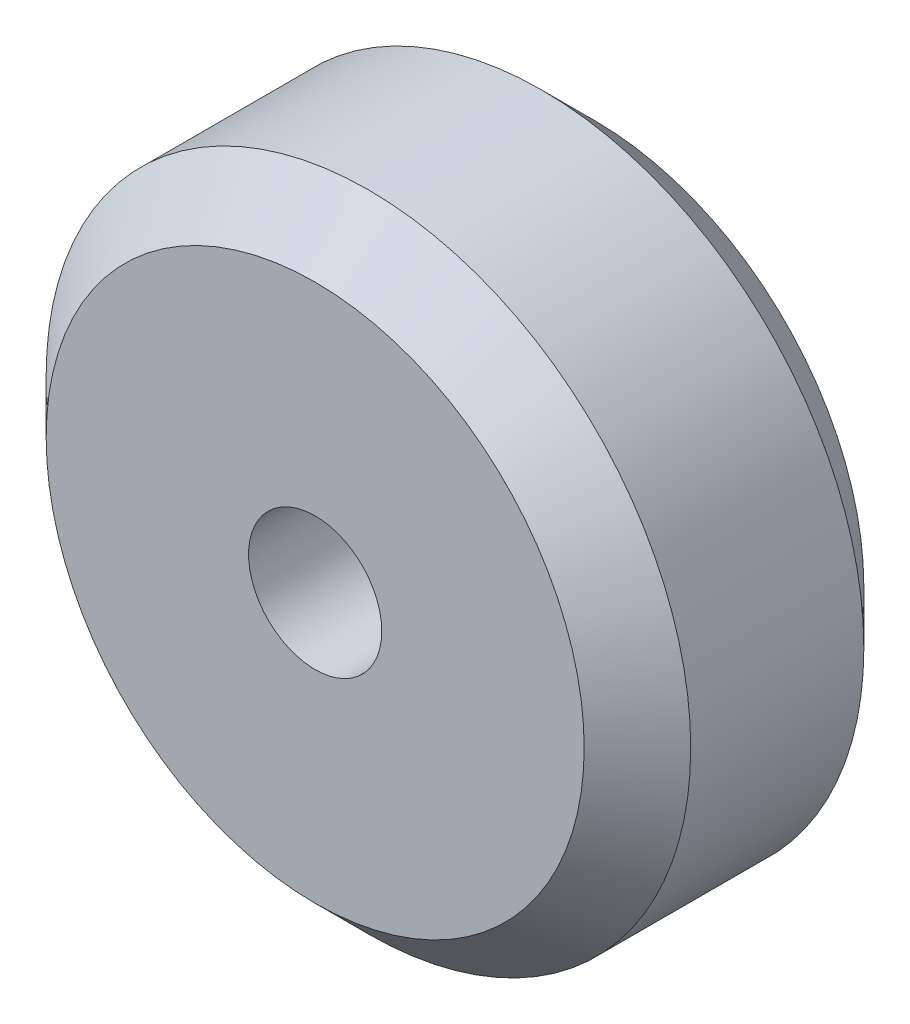
ISO-10303-21;
HEADER;
FILE_DESCRIPTION(('STEP AP214'),'2;1');
FILE_NAME('part.step','',(''),(''),'','','');
FILE_SCHEMA(('AUTOMOTIVE_DESIGN { 1 0 10303 214 1 1 1 1 }'));
ENDSEC;
DATA;
#1=APPLICATION_CONTEXT('core data for automotive mechanical design processes');
#2=APPLICATION_PROTOCOL_DEFINITION('international standard','automotive_design',2000,#1);
#3=PRODUCT_CONTEXT('',#1,'mechanical');
#4=PRODUCT('Part','Part','',(#3));
#5=PRODUCT_RELATED_PRODUCT_CATEGORY('part','',(#4));
#6=PRODUCT_DEFINITION_FORMATION('','',#4);
#7=PRODUCT_DEFINITION_CONTEXT('part definition',#1,'design');
#8=PRODUCT_DEFINITION('design','',#6,#7);
#9=PRODUCT_DEFINITION_SHAPE('','',#8);
#10=(LENGTH_UNIT() NAMED_UNIT(*) SI_UNIT(.MILLI.,.METRE.));
#11=(NAMED_UNIT(*) PLANE_ANGLE_UNIT() SI_UNIT($,.RADIAN.));
#12=(NAMED_UNIT(*) SI_UNIT($,.STERADIAN.) SOLID_ANGLE_UNIT());
#13=UNCERTAINTY_MEASURE_WITH_UNIT(LENGTH_MEASURE(1.E-05),#10,'distance_accuracy_value','');
#14=(GEOMETRIC_REPRESENTATION_CONTEXT(3) GLOBAL_UNCERTAINTY_ASSIGNED_CONTEXT((#13)) GLOBAL_UNIT_ASSIGNED_CONTEXT((#10,
#11,#12)) REPRESENTATION_CONTEXT('',''));
#15=CARTESIAN_POINT('',(0.,0.,0.));
#16=DIRECTION('',(0.,0.,1.));
#17=DIRECTION('',(1.,0.,0.));
#18=AXIS2_PLACEMENT_3D('',#15,#16,#17);
#19=CARTESIAN_POINT('',(0.,0.,10.5));
#20=DIRECTION('',(0.,0.,-1.));
#21=DIRECTION('',(-1.,0.,0.));
#22=AXIS2_PLACEMENT_3D('',#19,#20,#21);
#23=CYLINDRICAL_SURFACE('',#22,12.1);
#24=CARTESIAN_POINT('',(0.,0.,2.00000000000001));
#25=DIRECTION('',(0.,0.,1.));
#26=DIRECTION('',(1.,0.,0.));
#27=AXIS2_PLACEMENT_3D('',#24,#25,#26);
#28=CIRCLE('',#27,12.1);
#29=CARTESIAN_POINT('',(-12.1,0.,2.00000000000001));
#30=VERTEX_POINT('',#29);
#31=EDGE_CURVE('E45',#30,#30,#28,.T.);
#32=CARTESIAN_POINT('',(0.,0.,8.50000000000002));
#33=DIRECTION('',(0.,0.,1.));
#34=DIRECTION('',(1.,0.,0.));
#35=AXIS2_PLACEMENT_3D('',#32,#33,#34);
#36=CIRCLE('',#35,12.1);
#37=CARTESIAN_POINT('',(-12.1,0.,8.50000000000002));
#38=VERTEX_POINT('',#37);
#39=EDGE_CURVE('E49',#38,#38,#36,.F.);
#40=CARTESIAN_POINT('',(-12.1,0.,2.00000000000001));
#41=CARTESIAN_POINT('',(-12.1,0.,2.06770833333334));
#42=CARTESIAN_POINT('',(-12.1,0.,2.13541666666668));
#43=CARTESIAN_POINT('',(-12.1,0.,2.27083333333334));
#44=CARTESIAN_POINT('',(-12.1,0.,2.33854166666668));
#45=CARTESIAN_POINT('',(-12.1,0.,2.47395833333334));
#46=CARTESIAN_POINT('',(-12.1,0.,2.54166666666668));
#47=CARTESIAN_POINT('',(-12.1,0.,2.67708333333334));
#48=CARTESIAN_POINT('',(-12.1,0.,2.74479166666668));
#49=CARTESIAN_POINT('',(-12.1,0.,2.88020833333334));
#50=CARTESIAN_POINT('',(-12.1,0.,2.94791666666668));
#51=CARTESIAN_POINT('',(-12.1,0.,3.08333333333334));
#52=CARTESIAN_POINT('',(-12.1,0.,3.15104166666668));
#53=CARTESIAN_POINT('',(-12.1,0.,3.28645833333334));
#54=CARTESIAN_POINT('',(-12.1,0.,3.35416666666668));
#55=CARTESIAN_POINT('',(-12.1,0.,3.48958333333334));
#56=CARTESIAN_POINT('',(-12.1,0.,3.55729166666668));
#57=CARTESIAN_POINT('',(-12.1,0.,3.69270833333334));
#58=CARTESIAN_POINT('',(-12.1,0.,3.76041666666668));
#59=CARTESIAN_POINT('',(-12.1,0.,3.89583333333334));
#60=CARTESIAN_POINT('',(-12.1,0.,3.96354166666668));
#61=CARTESIAN_POINT('',(-12.1,0.,4.09895833333334));
#62=CARTESIAN_POINT('',(-12.1,0.,4.16666666666668));
#63=CARTESIAN_POINT('',(-12.1,0.,4.30208333333335));
#64=CARTESIAN_POINT('',(-12.1,0.,4.36979166666668));
#65=CARTESIAN_POINT('',(-12.1,0.,4.50520833333335));
#66=CARTESIAN_POINT('',(-12.1,0.,4.57291666666668));
#67=CARTESIAN_POINT('',(-12.1,0.,4.70833333333335));
#68=CARTESIAN_POINT('',(-12.1,0.,4.77604166666668));
#69=CARTESIAN_POINT('',(-12.1,0.,4.91145833333335));
#70=CARTESIAN_POINT('',(-12.1,0.,4.97916666666668));
#71=CARTESIAN_POINT('',(-12.1,0.,5.11458333333335));
#72=CARTESIAN_POINT('',(-12.1,0.,5.18229166666668));
#73=CARTESIAN_POINT('',(-12.1,0.,5.31770833333335));
#74=CARTESIAN_POINT('',(-12.1,0.,5.38541666666668));
#75=CARTESIAN_POINT('',(-12.1,0.,5.52083333333335));
#76=CARTESIAN_POINT('',(-12.1,0.,5.58854166666668));
#77=CARTESIAN_POINT('',(-12.1,0.,5.72395833333335));
#78=CARTESIAN_POINT('',(-12.1,0.,5.79166666666668));
#79=CARTESIAN_POINT('',(-12.1,0.,5.92708333333335));
#80=CARTESIAN_POINT('',(-12.1,0.,5.99479166666668));
#81=CARTESIAN_POINT('',(-12.1,0.,6.13020833333335));
#82=CARTESIAN_POINT('',(-12.1,0.,6.19791666666668));
#83=CARTESIAN_POINT('',(-12.1,0.,6.33333333333335));
#84=CARTESIAN_POINT('',(-12.1,0.,6.40104166666668));
#85=CARTESIAN_POINT('',(-12.1,0.,6.53645833333335));
#86=CARTESIAN_POINT('',(-12.1,0.,6.60416666666668));
#87=CARTESIAN_POINT('',(-12.1,0.,6.73958333333335));
#88=CARTESIAN_POINT('',(-12.1,0.,6.80729166666668));
#89=CARTESIAN_POINT('',(-12.1,0.,6.94270833333335));
#90=CARTESIAN_POINT('',(-12.1,0.,7.01041666666668));
#91=CARTESIAN_POINT('',(-12.1,0.,7.14583333333335));
#92=CARTESIAN_POINT('',(-12.1,0.,7.21354166666668));
#93=CARTESIAN_POINT('',(-12.1,0.,7.34895833333335));
#94=CARTESIAN_POINT('',(-12.1,0.,7.41666666666668));
#95=CARTESIAN_POINT('',(-12.1,0.,7.55208333333335));
#96=CARTESIAN_POINT('',(-12.1,0.,7.61979166666668));
#97=CARTESIAN_POINT('',(-12.1,0.,7.75520833333335));
#98=CARTESIAN_POINT('',(-12.1,0.,7.82291666666668));
#99=CARTESIAN_POINT('',(-12.1,0.,7.95833333333335));
#100=CARTESIAN_POINT('',(-12.1,0.,8.02604166666668));
#101=CARTESIAN_POINT('',(-12.1,0.,8.16145833333335));
#102=CARTESIAN_POINT('',(-12.1,0.,8.22916666666668));
#103=CARTESIAN_POINT('',(-12.1,0.,8.36458333333335));
#104=CARTESIAN_POINT('',(-12.1,0.,8.43229166666668));
#105=CARTESIAN_POINT('',(-12.1,0.,8.50000000000002));
#106=B_SPLINE_CURVE_WITH_KNOTS('',3,(#40,#41,#42,#43,#44,#45,#46,#47,#48,#49,#50,#51,#52,#53,
#54,#55,#56,#57,#58,#59,#60,#61,#62,#63,#64,#65,#66,#67,#68,#69,#70,#71,#72,#73,#74,#75,#76,#77,
#78,#79,#80,#81,#82,#83,#84,#85,#86,#87,#88,#89,#90,#91,#92,#93,#94,#95,#96,#97,#98,#99,#100,
#101,#102,#103,#104,#105),.UNSPECIFIED.,.F.,.F.,(4,2,2,2,2,2,2,2,2,2,2,2,2,2,2,2,2,2,2,2,2,2,2,
2,2,2,2,2,2,2,2,2,4),(0.,0.203125,0.40625,0.609375000000001,0.8125,1.015625,1.21875,1.421875,
1.625,1.828125,2.03125,2.234375,2.4375,2.640625,2.84375,3.046875,3.25,3.453125,3.65625,3.859375,
4.0625,4.26562500000001,4.46875000000001,4.67187500000001,4.87500000000001,5.07812500000001,
5.28125000000001,5.48437500000001,5.68750000000001,5.89062500000001,6.09375000000001,
6.29687500000001,6.50000000000001),.UNSPECIFIED.);
#107=EDGE_CURVE('BSEAM33',#30,#38,#106,.T.);
#108=ORIENTED_EDGE('',*,*,#31,.T.);
#109=ORIENTED_EDGE('',*,*,#39,.T.);
#110=ORIENTED_EDGE('',*,*,#107,.T.);
#111=ORIENTED_EDGE('',*,*,#107,.F.);
#112=EDGE_LOOP('',(#108,#110,#109,#111));
#113=FACE_BOUND('',#112,.T.);
#114=ADVANCED_FACE('F33',(#113),#23,.T.);
#115=CARTESIAN_POINT('',(0.,0.,10.5));
#116=DIRECTION('',(0.,0.,1.));
#117=DIRECTION('',(1.,0.,0.));
#118=AXIS2_PLACEMENT_3D('',#115,#116,#117);
#119=PLANE('',#118);
#120=CARTESIAN_POINT('',(0.,0.,10.5));
#121=DIRECTION('',(0.,0.,1.));
#122=DIRECTION('',(1.,0.,0.));
#123=AXIS2_PLACEMENT_3D('',#120,#121,#122);
#124=CIRCLE('',#123,10.1);
#125=CARTESIAN_POINT('',(10.1,0.,10.5));
#126=VERTEX_POINT('',#125);
#127=EDGE_CURVE('E10',#126,#126,#124,.T.);
#128=ORIENTED_EDGE('',*,*,#127,.T.);
#129=EDGE_LOOP('',(#128));
#130=FACE_BOUND('',#129,.T.);
#131=CARTESIAN_POINT('',(0.,0.,10.5));
#132=DIRECTION('',(0.,0.,1.));
#133=DIRECTION('',(1.,0.,0.));
#134=AXIS2_PLACEMENT_3D('',#131,#132,#133);
#135=CIRCLE('',#134,2.5);
#136=CARTESIAN_POINT('',(2.5,0.,10.5));
#137=VERTEX_POINT('',#136);
#138=EDGE_CURVE('E55',#137,#137,#135,.T.);
#139=ORIENTED_EDGE('',*,*,#138,.F.);
#140=EDGE_LOOP('',(#139));
#141=FACE_BOUND('',#140,.T.);
#142=ADVANCED_FACE('F70',(#130,#141),#119,.T.);
#143=CARTESIAN_POINT('',(0.,0.,0.));
#144=DIRECTION('',(0.,0.,1.));
#145=DIRECTION('',(1.,0.,0.));
#146=AXIS2_PLACEMENT_3D('',#143,#144,#145);
#147=PLANE('',#146);
#148=CARTESIAN_POINT('',(0.,0.,0.));
#149=DIRECTION('',(0.,0.,1.));
#150=DIRECTION('',(1.,0.,0.));
#151=AXIS2_PLACEMENT_3D('',#148,#149,#150);
#152=CIRCLE('',#151,10.1);
#153=CARTESIAN_POINT('',(10.1,0.,0.));
#154=VERTEX_POINT('',#153);
#155=EDGE_CURVE('E41',#154,#154,#152,.F.);
#156=ORIENTED_EDGE('',*,*,#155,.T.);
#157=EDGE_LOOP('',(#156));
#158=FACE_BOUND('',#157,.T.);
#159=CARTESIAN_POINT('',(0.,0.,0.));
#160=DIRECTION('',(0.,0.,1.));
#161=DIRECTION('',(1.,0.,0.));
#162=AXIS2_PLACEMENT_3D('',#159,#160,#161);
#163=CIRCLE('',#162,2.5);
#164=CARTESIAN_POINT('',(2.5,0.,0.));
#165=VERTEX_POINT('',#164);
#166=EDGE_CURVE('E54',#165,#165,#163,.T.);
#167=ORIENTED_EDGE('',*,*,#166,.T.);
#168=EDGE_LOOP('',(#167));
#169=FACE_BOUND('',#168,.T.);
#170=ADVANCED_FACE('F61',(#158,#169),#147,.F.);
#171=CARTESIAN_POINT('',(0.,0.,0.));
#172=DIRECTION('',(0.,0.,1.));
#173=DIRECTION('',(1.,0.,0.));
#174=AXIS2_PLACEMENT_3D('',#171,#172,#173);
#175=CYLINDRICAL_SURFACE('',#174,2.5);
#176=CARTESIAN_POINT('',(2.5,0.,0.));
#177=CARTESIAN_POINT('',(2.5,0.,0.109375));
#178=CARTESIAN_POINT('',(2.5,0.,0.21875));
#179=CARTESIAN_POINT('',(2.5,0.,0.4375));
#180=CARTESIAN_POINT('',(2.5,0.,0.546875));
#181=CARTESIAN_POINT('',(2.5,0.,0.765625));
#182=CARTESIAN_POINT('',(2.5,0.,0.875));
#183=CARTESIAN_POINT('',(2.5,0.,1.09375));
#184=CARTESIAN_POINT('',(2.5,0.,1.203125));
#185=CARTESIAN_POINT('',(2.5,0.,1.421875));
#186=CARTESIAN_POINT('',(2.5,0.,1.53125));
#187=CARTESIAN_POINT('',(2.5,0.,1.75));
#188=CARTESIAN_POINT('',(2.5,0.,1.859375));
#189=CARTESIAN_POINT('',(2.5,0.,2.078125));
#190=CARTESIAN_POINT('',(2.5,0.,2.1875));
#191=CARTESIAN_POINT('',(2.5,0.,2.40625));
#192=CARTESIAN_POINT('',(2.5,0.,2.515625));
#193=CARTESIAN_POINT('',(2.5,0.,2.734375));
#194=CARTESIAN_POINT('',(2.5,0.,2.84375));
#195=CARTESIAN_POINT('',(2.5,0.,3.0625));
#196=CARTESIAN_POINT('',(2.5,0.,3.171875));
#197=CARTESIAN_POINT('',(2.5,0.,3.390625));
#198=CARTESIAN_POINT('',(2.5,0.,3.5));
#199=CARTESIAN_POINT('',(2.5,0.,3.71875));
#200=CARTESIAN_POINT('',(2.5,0.,3.828125));
#201=CARTESIAN_POINT('',(2.5,0.,4.046875));
#202=CARTESIAN_POINT('',(2.5,0.,4.15625));
#203=CARTESIAN_POINT('',(2.5,0.,4.375));
#204=CARTESIAN_POINT('',(2.5,0.,4.484375));
#205=CARTESIAN_POINT('',(2.5,0.,4.703125));
#206=CARTESIAN_POINT('',(2.5,0.,4.8125));
#207=CARTESIAN_POINT('',(2.5,0.,5.03125));
#208=CARTESIAN_POINT('',(2.5,0.,5.140625));
#209=CARTESIAN_POINT('',(2.5,0.,5.359375));
#210=CARTESIAN_POINT('',(2.5,0.,5.46875));
#211=CARTESIAN_POINT('',(2.5,0.,5.6875));
#212=CARTESIAN_POINT('',(2.5,0.,5.796875));
#213=CARTESIAN_POINT('',(2.5,0.,6.015625));
#214=CARTESIAN_POINT('',(2.5,0.,6.125));
#215=CARTESIAN_POINT('',(2.5,0.,6.34375));
#216=CARTESIAN_POINT('',(2.5,0.,6.453125));
#217=CARTESIAN_POINT('',(2.5,0.,6.671875));
#218=CARTESIAN_POINT('',(2.5,0.,6.78125));
#219=CARTESIAN_POINT('',(2.5,0.,7.));
#220=CARTESIAN_POINT('',(2.5,0.,7.109375));
#221=CARTESIAN_POINT('',(2.5,0.,7.328125));
#222=CARTESIAN_POINT('',(2.5,0.,7.4375));
#223=CARTESIAN_POINT('',(2.5,0.,7.65625));
#224=CARTESIAN_POINT('',(2.5,0.,7.765625));
#225=CARTESIAN_POINT('',(2.5,0.,7.984375));
#226=CARTESIAN_POINT('',(2.5,0.,8.09375));
#227=CARTESIAN_POINT('',(2.5,0.,8.3125));
#228=CARTESIAN_POINT('',(2.5,0.,8.421875));
#229=CARTESIAN_POINT('',(2.5,0.,8.640625));
#230=CARTESIAN_POINT('',(2.5,0.,8.75));
#231=CARTESIAN_POINT('',(2.5,0.,8.96875));
#232=CARTESIAN_POINT('',(2.5,0.,9.078125));
#233=CARTESIAN_POINT('',(2.5,0.,9.296875));
#234=CARTESIAN_POINT('',(2.5,0.,9.40625));
#235=CARTESIAN_POINT('',(2.5,0.,9.625));
#236=CARTESIAN_POINT('',(2.5,0.,9.734375));
#237=CARTESIAN_POINT('',(2.5,0.,9.953125));
#238=CARTESIAN_POINT('',(2.5,0.,10.0625));
#239=CARTESIAN_POINT('',(2.5,0.,10.28125));
#240=CARTESIAN_POINT('',(2.5,0.,10.390625));
#241=CARTESIAN_POINT('',(2.5,0.,10.5));
#242=B_SPLINE_CURVE_WITH_KNOTS('',3,(#176,#177,#178,#179,#180,#181,#182,#183,#184,#185,#186,
#187,#188,#189,#190,#191,#192,#193,#194,#195,#196,#197,#198,#199,#200,#201,#202,#203,#204,#205,
#206,#207,#208,#209,#210,#211,#212,#213,#214,#215,#216,#217,#218,#219,#220,#221,#222,#223,#224,
#225,#226,#227,#228,#229,#230,#231,#232,#233,#234,#235,#236,#237,#238,#239,#240,#241),
.UNSPECIFIED.,.F.,.F.,(4,2,2,2,2,2,2,2,2,2,2,2,2,2,2,2,2,2,2,2,2,2,2,2,2,2,2,2,2,2,2,2,4),(0.,
0.328125,0.65625,0.984375,1.3125,1.640625,1.96875,2.296875,2.625,2.953125,3.28125,3.609375,
3.9375,4.265625,4.59375,4.921875,5.25,5.578125,5.90625,6.234375,6.5625,6.890625,7.21875,
7.546875,7.875,8.203125,8.53125,8.859375,9.1875,9.515625,9.84375,10.171875,10.5),.UNSPECIFIED.);
#243=EDGE_CURVE('BSEAM63',#165,#137,#242,.T.);
#244=ORIENTED_EDGE('',*,*,#166,.F.);
#245=ORIENTED_EDGE('',*,*,#138,.T.);
#246=ORIENTED_EDGE('',*,*,#243,.T.);
#247=ORIENTED_EDGE('',*,*,#243,.F.);
#248=EDGE_LOOP('',(#244,#246,#245,#247));
#249=FACE_BOUND('',#248,.T.);
#250=ADVANCED_FACE('F63',(#249),#175,.F.);
#251=CARTESIAN_POINT('',(0.,0.,2.00000000000001));
#252=DIRECTION('',(0.,0.,1.));
#253=DIRECTION('',(1.,0.,0.));
#254=AXIS2_PLACEMENT_3D('',#251,#252,#253);
#255=CONICAL_SURFACE('',#254,12.1,0.78539816339745);
#256=ORIENTED_EDGE('',*,*,#155,.F.);
#257=EDGE_LOOP('',(#256));
#258=FACE_BOUND('',#257,.T.);
#259=ORIENTED_EDGE('',*,*,#31,.F.);
#260=EDGE_LOOP('',(#259));
#261=FACE_BOUND('',#260,.T.);
#262=ADVANCED_FACE('F66',(#258,#261),#255,.T.);
#263=CARTESIAN_POINT('',(0.,0.,10.5));
#264=DIRECTION('',(0.,0.,-1.));
#265=DIRECTION('',(-1.,0.,0.));
#266=AXIS2_PLACEMENT_3D('',#263,#264,#265);
#267=CONICAL_SURFACE('',#266,10.1,0.785398163397447);
#268=ORIENTED_EDGE('',*,*,#39,.F.);
#269=EDGE_LOOP('',(#268));
#270=FACE_BOUND('',#269,.T.);
#271=ORIENTED_EDGE('',*,*,#127,.F.);
#272=EDGE_LOOP('',(#271));
#273=FACE_BOUND('',#272,.T.);
#274=ADVANCED_FACE('F36',(#270,#273),#267,.T.);
#275=CLOSED_SHELL('',(#114,#142,#170,#250,#262,#274));
#276=MANIFOLD_SOLID_BREP('B2',#275);
#277=ADVANCED_BREP_SHAPE_REPRESENTATION('',(#18,#276),#14);
#278=SHAPE_DEFINITION_REPRESENTATION(#9,#277);
ENDSEC;
END-ISO-10303-21;
